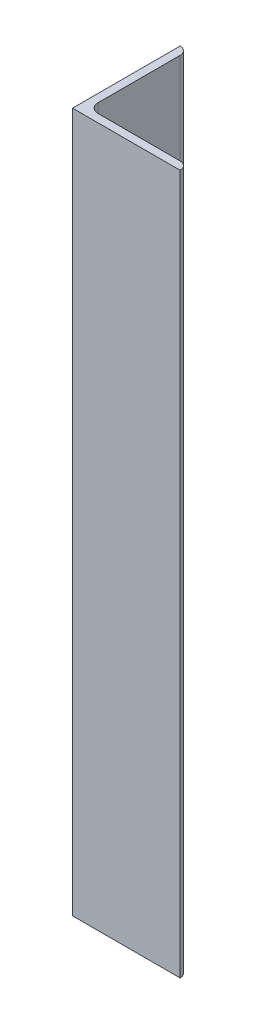
ISO-10303-21;
HEADER;
FILE_DESCRIPTION(('STEP AP214'),'2;1');
FILE_NAME('part.step','',(''),(''),'','','');
FILE_SCHEMA(('AUTOMOTIVE_DESIGN { 1 0 10303 214 1 1 1 1 }'));
ENDSEC;
DATA;
#1=APPLICATION_CONTEXT('core data for automotive mechanical design processes');
#2=APPLICATION_PROTOCOL_DEFINITION('international standard','automotive_design',2000,#1);
#3=PRODUCT_CONTEXT('',#1,'mechanical');
#4=PRODUCT('Part','Part','',(#3));
#5=PRODUCT_RELATED_PRODUCT_CATEGORY('part','',(#4));
#6=PRODUCT_DEFINITION_FORMATION('','',#4);
#7=PRODUCT_DEFINITION_CONTEXT('part definition',#1,'design');
#8=PRODUCT_DEFINITION('design','',#6,#7);
#9=PRODUCT_DEFINITION_SHAPE('','',#8);
#10=(LENGTH_UNIT() NAMED_UNIT(*) SI_UNIT(.MILLI.,.METRE.));
#11=(NAMED_UNIT(*) PLANE_ANGLE_UNIT() SI_UNIT($,.RADIAN.));
#12=(NAMED_UNIT(*) SI_UNIT($,.STERADIAN.) SOLID_ANGLE_UNIT());
#13=UNCERTAINTY_MEASURE_WITH_UNIT(LENGTH_MEASURE(1.E-05),#10,'distance_accuracy_value','');
#14=(GEOMETRIC_REPRESENTATION_CONTEXT(3) GLOBAL_UNCERTAINTY_ASSIGNED_CONTEXT((#13)) GLOBAL_UNIT_ASSIGNED_CONTEXT((#10,
#11,#12)) REPRESENTATION_CONTEXT('',''));
#15=CARTESIAN_POINT('',(0.,0.,0.));
#16=DIRECTION('',(0.,0.,1.));
#17=DIRECTION('',(1.,0.,0.));
#18=AXIS2_PLACEMENT_3D('',#15,#16,#17);
#19=CARTESIAN_POINT('',(40.,260.,0.));
#20=DIRECTION('',(0.,0.,-1.));
#21=DIRECTION('',(-1.,0.,0.));
#22=AXIS2_PLACEMENT_3D('',#19,#20,#21);
#23=PLANE('',#22);
#24=DIRECTION('',(1.,0.,0.));
#25=VECTOR('',#24,1.);
#26=CARTESIAN_POINT('',(40.,0.,0.));
#27=LINE('',#26,#25);
#28=CARTESIAN_POINT('',(0.,0.,0.));
#29=VERTEX_POINT('',#28);
#30=CARTESIAN_POINT('',(40.,0.,0.));
#31=VERTEX_POINT('',#30);
#32=EDGE_CURVE('E152',#29,#31,#27,.T.);
#33=ORIENTED_EDGE('',*,*,#32,.T.);
#34=DIRECTION('',(0.,-1.,0.));
#35=VECTOR('',#34,1.);
#36=CARTESIAN_POINT('',(40.,260.,0.));
#37=LINE('',#36,#35);
#38=CARTESIAN_POINT('',(40.,260.,0.));
#39=VERTEX_POINT('',#38);
#40=EDGE_CURVE('E13',#39,#31,#37,.T.);
#41=ORIENTED_EDGE('',*,*,#40,.F.);
#42=DIRECTION('',(1.,0.,0.));
#43=VECTOR('',#42,1.);
#44=CARTESIAN_POINT('',(40.,260.,0.));
#45=LINE('',#44,#43);
#46=CARTESIAN_POINT('',(0.,260.,0.));
#47=VERTEX_POINT('',#46);
#48=EDGE_CURVE('E164',#47,#39,#45,.T.);
#49=ORIENTED_EDGE('',*,*,#48,.F.);
#50=DIRECTION('',(0.,-1.,0.));
#51=VECTOR('',#50,1.);
#52=CARTESIAN_POINT('',(0.,260.,0.));
#53=LINE('',#52,#51);
#54=EDGE_CURVE('E148',#47,#29,#53,.T.);
#55=ORIENTED_EDGE('',*,*,#54,.T.);
#56=EDGE_LOOP('',(#33,#41,#49,#55));
#57=FACE_BOUND('',#56,.T.);
#58=ADVANCED_FACE('F62',(#57),#23,.F.);
#59=CARTESIAN_POINT('',(37.,260.,0.));
#60=DIRECTION('',(0.,-1.,0.));
#61=DIRECTION('',(0.,0.,-1.));
#62=AXIS2_PLACEMENT_3D('',#59,#60,#61);
#63=CYLINDRICAL_SURFACE('',#62,3.00000000000001);
#64=CARTESIAN_POINT('',(37.,0.,0.));
#65=DIRECTION('',(0.,1.,0.));
#66=DIRECTION('',(0.,0.,1.));
#67=AXIS2_PLACEMENT_3D('',#64,#65,#66);
#68=CIRCLE('',#67,3.00000000000001);
#69=CARTESIAN_POINT('',(37.,0.,-3.));
#70=VERTEX_POINT('',#69);
#71=EDGE_CURVE('E155',#31,#70,#68,.T.);
#72=ORIENTED_EDGE('',*,*,#71,.T.);
#73=DIRECTION('',(0.,-1.,0.));
#74=VECTOR('',#73,1.);
#75=CARTESIAN_POINT('',(37.,260.,-3.));
#76=LINE('',#75,#74);
#77=CARTESIAN_POINT('',(37.,260.,-3.));
#78=VERTEX_POINT('',#77);
#79=EDGE_CURVE('E70',#78,#70,#76,.T.);
#80=ORIENTED_EDGE('',*,*,#79,.F.);
#81=CARTESIAN_POINT('',(37.,260.,0.));
#82=DIRECTION('',(0.,1.,0.));
#83=DIRECTION('',(0.,0.,1.));
#84=AXIS2_PLACEMENT_3D('',#81,#82,#83);
#85=CIRCLE('',#84,3.00000000000001);
#86=EDGE_CURVE('E118',#39,#78,#85,.T.);
#87=ORIENTED_EDGE('',*,*,#86,.F.);
#88=ORIENTED_EDGE('',*,*,#40,.T.);
#89=EDGE_LOOP('',(#72,#80,#87,#88));
#90=FACE_BOUND('',#89,.T.);
#91=ADVANCED_FACE('F189',(#90),#63,.T.);
#92=CARTESIAN_POINT('',(6.5,260.,-3.));
#93=DIRECTION('',(0.,0.,1.));
#94=DIRECTION('',(1.,0.,0.));
#95=AXIS2_PLACEMENT_3D('',#92,#93,#94);
#96=PLANE('',#95);
#97=DIRECTION('',(-1.,0.,0.));
#98=VECTOR('',#97,1.);
#99=CARTESIAN_POINT('',(6.5,0.,-3.));
#100=LINE('',#99,#98);
#101=CARTESIAN_POINT('',(6.5,0.,-3.));
#102=VERTEX_POINT('',#101);
#103=EDGE_CURVE('E157',#70,#102,#100,.T.);
#104=ORIENTED_EDGE('',*,*,#103,.T.);
#105=DIRECTION('',(0.,-1.,0.));
#106=VECTOR('',#105,1.);
#107=CARTESIAN_POINT('',(6.5,260.,-3.));
#108=LINE('',#107,#106);
#109=CARTESIAN_POINT('',(6.5,260.,-3.));
#110=VERTEX_POINT('',#109);
#111=EDGE_CURVE('E168',#110,#102,#108,.T.);
#112=ORIENTED_EDGE('',*,*,#111,.F.);
#113=DIRECTION('',(-1.,0.,0.));
#114=VECTOR('',#113,1.);
#115=CARTESIAN_POINT('',(6.5,260.,-3.));
#116=LINE('',#115,#114);
#117=EDGE_CURVE('E176',#78,#110,#116,.T.);
#118=ORIENTED_EDGE('',*,*,#117,.F.);
#119=ORIENTED_EDGE('',*,*,#79,.T.);
#120=EDGE_LOOP('',(#104,#112,#118,#119));
#121=FACE_BOUND('',#120,.T.);
#122=ADVANCED_FACE('F174',(#121),#96,.F.);
#123=CARTESIAN_POINT('',(6.5,260.,-6.5));
#124=DIRECTION('',(0.,-1.,0.));
#125=DIRECTION('',(0.,0.,-1.));
#126=AXIS2_PLACEMENT_3D('',#123,#124,#125);
#127=CYLINDRICAL_SURFACE('',#126,3.5);
#128=CARTESIAN_POINT('',(6.5,0.,-6.5));
#129=DIRECTION('',(0.,-1.,0.));
#130=DIRECTION('',(0.,0.,-1.));
#131=AXIS2_PLACEMENT_3D('',#128,#129,#130);
#132=CIRCLE('',#131,3.5);
#133=CARTESIAN_POINT('',(3.,0.,-6.5));
#134=VERTEX_POINT('',#133);
#135=EDGE_CURVE('E159',#102,#134,#132,.T.);
#136=ORIENTED_EDGE('',*,*,#135,.T.);
#137=DIRECTION('',(0.,-1.,0.));
#138=VECTOR('',#137,1.);
#139=CARTESIAN_POINT('',(3.,260.,-6.5));
#140=LINE('',#139,#138);
#141=CARTESIAN_POINT('',(3.,260.,-6.5));
#142=VERTEX_POINT('',#141);
#143=EDGE_CURVE('E143',#142,#134,#140,.T.);
#144=ORIENTED_EDGE('',*,*,#143,.F.);
#145=CARTESIAN_POINT('',(6.5,260.,-6.5));
#146=DIRECTION('',(0.,-1.,0.));
#147=DIRECTION('',(0.,0.,-1.));
#148=AXIS2_PLACEMENT_3D('',#145,#146,#147);
#149=CIRCLE('',#148,3.5);
#150=EDGE_CURVE('E134',#110,#142,#149,.T.);
#151=ORIENTED_EDGE('',*,*,#150,.F.);
#152=ORIENTED_EDGE('',*,*,#111,.T.);
#153=EDGE_LOOP('',(#136,#144,#151,#152));
#154=FACE_BOUND('',#153,.T.);
#155=ADVANCED_FACE('F182',(#154),#127,.F.);
#156=CARTESIAN_POINT('',(3.,260.,-37.));
#157=DIRECTION('',(-1.,0.,0.));
#158=DIRECTION('',(0.,0.,1.));
#159=AXIS2_PLACEMENT_3D('',#156,#157,#158);
#160=PLANE('',#159);
#161=DIRECTION('',(0.,0.,-1.));
#162=VECTOR('',#161,1.);
#163=CARTESIAN_POINT('',(3.,0.,-37.));
#164=LINE('',#163,#162);
#165=CARTESIAN_POINT('',(3.,0.,-37.));
#166=VERTEX_POINT('',#165);
#167=EDGE_CURVE('E142',#134,#166,#164,.T.);
#168=ORIENTED_EDGE('',*,*,#167,.T.);
#169=DIRECTION('',(0.,-1.,0.));
#170=VECTOR('',#169,1.);
#171=CARTESIAN_POINT('',(3.,260.,-37.));
#172=LINE('',#171,#170);
#173=CARTESIAN_POINT('',(3.,260.,-37.));
#174=VERTEX_POINT('',#173);
#175=EDGE_CURVE('E139',#174,#166,#172,.T.);
#176=ORIENTED_EDGE('',*,*,#175,.F.);
#177=DIRECTION('',(0.,0.,-1.));
#178=VECTOR('',#177,1.);
#179=CARTESIAN_POINT('',(3.,260.,-37.));
#180=LINE('',#179,#178);
#181=EDGE_CURVE('E128',#142,#174,#180,.T.);
#182=ORIENTED_EDGE('',*,*,#181,.F.);
#183=ORIENTED_EDGE('',*,*,#143,.T.);
#184=EDGE_LOOP('',(#168,#176,#182,#183));
#185=FACE_BOUND('',#184,.T.);
#186=ADVANCED_FACE('F140',(#185),#160,.F.);
#187=CARTESIAN_POINT('',(0.,260.,-37.));
#188=DIRECTION('',(0.,-1.,0.));
#189=DIRECTION('',(0.,0.,-1.));
#190=AXIS2_PLACEMENT_3D('',#187,#188,#189);
#191=CYLINDRICAL_SURFACE('',#190,3.);
#192=CARTESIAN_POINT('',(0.,0.,-37.));
#193=DIRECTION('',(0.,1.,0.));
#194=DIRECTION('',(0.,0.,-1.));
#195=AXIS2_PLACEMENT_3D('',#192,#193,#194);
#196=CIRCLE('',#195,3.);
#197=CARTESIAN_POINT('',(0.,0.,-40.));
#198=VERTEX_POINT('',#197);
#199=EDGE_CURVE('E104',#166,#198,#196,.T.);
#200=ORIENTED_EDGE('',*,*,#199,.T.);
#201=DIRECTION('',(0.,-1.,0.));
#202=VECTOR('',#201,1.);
#203=CARTESIAN_POINT('',(0.,260.,-40.));
#204=LINE('',#203,#202);
#205=CARTESIAN_POINT('',(0.,260.,-40.));
#206=VERTEX_POINT('',#205);
#207=EDGE_CURVE('E144',#206,#198,#204,.T.);
#208=ORIENTED_EDGE('',*,*,#207,.F.);
#209=CARTESIAN_POINT('',(0.,260.,-37.));
#210=DIRECTION('',(0.,1.,0.));
#211=DIRECTION('',(0.,0.,-1.));
#212=AXIS2_PLACEMENT_3D('',#209,#210,#211);
#213=CIRCLE('',#212,3.);
#214=EDGE_CURVE('E132',#174,#206,#213,.T.);
#215=ORIENTED_EDGE('',*,*,#214,.F.);
#216=ORIENTED_EDGE('',*,*,#175,.T.);
#217=EDGE_LOOP('',(#200,#208,#215,#216));
#218=FACE_BOUND('',#217,.T.);
#219=ADVANCED_FACE('F146',(#218),#191,.T.);
#220=CARTESIAN_POINT('',(0.,260.,0.));
#221=DIRECTION('',(1.,0.,0.));
#222=DIRECTION('',(0.,0.,-1.));
#223=AXIS2_PLACEMENT_3D('',#220,#221,#222);
#224=PLANE('',#223);
#225=DIRECTION('',(0.,0.,1.));
#226=VECTOR('',#225,1.);
#227=CARTESIAN_POINT('',(0.,0.,0.));
#228=LINE('',#227,#226);
#229=EDGE_CURVE('E110',#198,#29,#228,.T.);
#230=ORIENTED_EDGE('',*,*,#229,.T.);
#231=ORIENTED_EDGE('',*,*,#54,.F.);
#232=DIRECTION('',(0.,0.,1.));
#233=VECTOR('',#232,1.);
#234=CARTESIAN_POINT('',(0.,260.,0.));
#235=LINE('',#234,#233);
#236=EDGE_CURVE('E78',#206,#47,#235,.T.);
#237=ORIENTED_EDGE('',*,*,#236,.F.);
#238=ORIENTED_EDGE('',*,*,#207,.T.);
#239=EDGE_LOOP('',(#230,#231,#237,#238));
#240=FACE_BOUND('',#239,.T.);
#241=ADVANCED_FACE('F203',(#240),#224,.F.);
#242=CARTESIAN_POINT('',(0.,260.,-37.));
#243=DIRECTION('',(0.,-1.,0.));
#244=DIRECTION('',(0.,0.,-1.));
#245=AXIS2_PLACEMENT_3D('',#242,#243,#244);
#246=PLANE('',#245);
#247=ORIENTED_EDGE('',*,*,#48,.T.);
#248=ORIENTED_EDGE('',*,*,#86,.T.);
#249=ORIENTED_EDGE('',*,*,#117,.T.);
#250=ORIENTED_EDGE('',*,*,#150,.T.);
#251=ORIENTED_EDGE('',*,*,#181,.T.);
#252=ORIENTED_EDGE('',*,*,#214,.T.);
#253=ORIENTED_EDGE('',*,*,#236,.T.);
#254=EDGE_LOOP('',(#247,#248,#249,#250,#251,#252,#253));
#255=FACE_BOUND('',#254,.T.);
#256=ADVANCED_FACE('F130',(#255),#246,.F.);
#257=CARTESIAN_POINT('',(0.,0.,-37.));
#258=DIRECTION('',(0.,-1.,0.));
#259=DIRECTION('',(0.,0.,-1.));
#260=AXIS2_PLACEMENT_3D('',#257,#258,#259);
#261=PLANE('',#260);
#262=ORIENTED_EDGE('',*,*,#32,.F.);
#263=ORIENTED_EDGE('',*,*,#229,.F.);
#264=ORIENTED_EDGE('',*,*,#199,.F.);
#265=ORIENTED_EDGE('',*,*,#167,.F.);
#266=ORIENTED_EDGE('',*,*,#135,.F.);
#267=ORIENTED_EDGE('',*,*,#103,.F.);
#268=ORIENTED_EDGE('',*,*,#71,.F.);
#269=EDGE_LOOP('',(#262,#263,#264,#265,#266,#267,#268));
#270=FACE_BOUND('',#269,.T.);
#271=ADVANCED_FACE('F180',(#270),#261,.T.);
#272=CLOSED_SHELL('',(#58,#91,#122,#155,#186,#219,#241,#256,#271));
#273=MANIFOLD_SOLID_BREP('B2',#272);
#274=ADVANCED_BREP_SHAPE_REPRESENTATION('',(#18,#273),#14);
#275=SHAPE_DEFINITION_REPRESENTATION(#9,#274);
ENDSEC;
END-ISO-10303-21;
